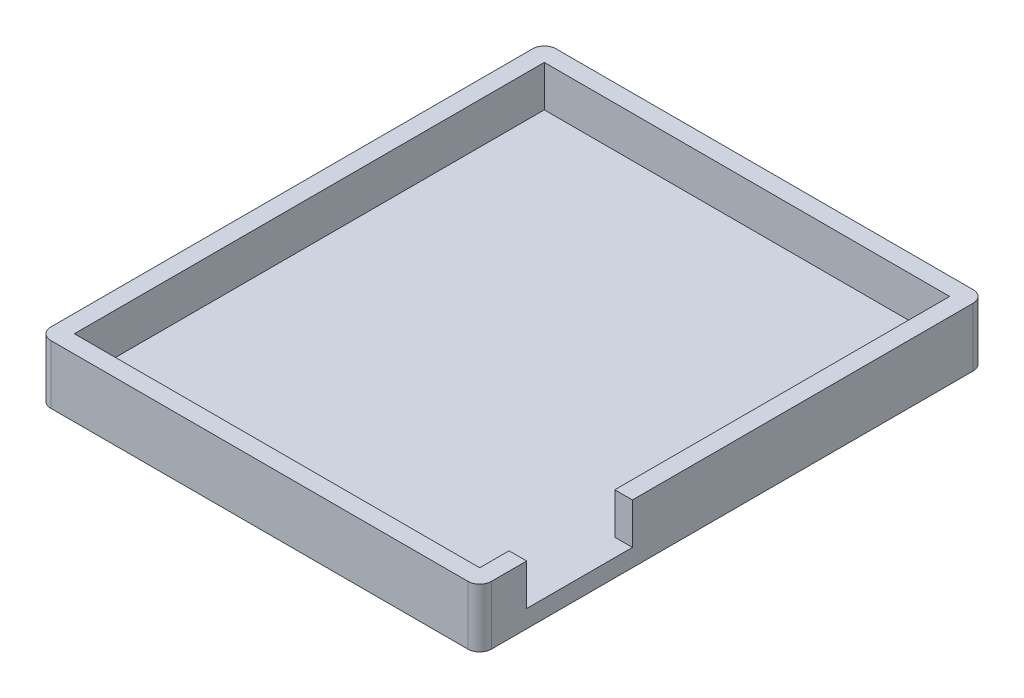
ISO-10303-21;
HEADER;
FILE_DESCRIPTION(('STEP AP214'),'2;1');
FILE_NAME('part.step','',(''),(''),'','','');
FILE_SCHEMA(('AUTOMOTIVE_DESIGN { 1 0 10303 214 1 1 1 1 }'));
ENDSEC;
DATA;
#1=APPLICATION_CONTEXT('core data for automotive mechanical design processes');
#2=APPLICATION_PROTOCOL_DEFINITION('international standard','automotive_design',2000,#1);
#3=PRODUCT_CONTEXT('',#1,'mechanical');
#4=PRODUCT('Part','Part','',(#3));
#5=PRODUCT_RELATED_PRODUCT_CATEGORY('part','',(#4));
#6=PRODUCT_DEFINITION_FORMATION('','',#4);
#7=PRODUCT_DEFINITION_CONTEXT('part definition',#1,'design');
#8=PRODUCT_DEFINITION('design','',#6,#7);
#9=PRODUCT_DEFINITION_SHAPE('','',#8);
#10=(LENGTH_UNIT() NAMED_UNIT(*) SI_UNIT(.MILLI.,.METRE.));
#11=(NAMED_UNIT(*) PLANE_ANGLE_UNIT() SI_UNIT($,.RADIAN.));
#12=(NAMED_UNIT(*) SI_UNIT($,.STERADIAN.) SOLID_ANGLE_UNIT());
#13=UNCERTAINTY_MEASURE_WITH_UNIT(LENGTH_MEASURE(1.E-05),#10,'distance_accuracy_value','');
#14=(GEOMETRIC_REPRESENTATION_CONTEXT(3) GLOBAL_UNCERTAINTY_ASSIGNED_CONTEXT((#13)) GLOBAL_UNIT_ASSIGNED_CONTEXT((#10,
#11,#12)) REPRESENTATION_CONTEXT('',''));
#15=CARTESIAN_POINT('',(0.,0.,0.));
#16=DIRECTION('',(0.,0.,1.));
#17=DIRECTION('',(1.,0.,0.));
#18=AXIS2_PLACEMENT_3D('',#15,#16,#17);
#19=CARTESIAN_POINT('',(37.5,3.,0.));
#20=DIRECTION('',(-1.,0.,0.));
#21=DIRECTION('',(0.,0.,1.));
#22=AXIS2_PLACEMENT_3D('',#19,#20,#21);
#23=PLANE('',#22);
#24=DIRECTION('',(0.,0.,-1.));
#25=VECTOR('',#24,1.);
#26=CARTESIAN_POINT('',(37.5,0.,0.));
#27=LINE('',#26,#25);
#28=CARTESIAN_POINT('',(37.5,0.,41.));
#29=VERTEX_POINT('',#28);
#30=CARTESIAN_POINT('',(37.5,0.,-41.));
#31=VERTEX_POINT('',#30);
#32=EDGE_CURVE('E235',#29,#31,#27,.T.);
#33=ORIENTED_EDGE('',*,*,#32,.T.);
#34=DIRECTION('',(0.,-1.,0.));
#35=VECTOR('',#34,1.);
#36=CARTESIAN_POINT('',(37.5,3.,-41.));
#37=LINE('',#36,#35);
#38=CARTESIAN_POINT('',(37.5,10.,-41.));
#39=VERTEX_POINT('',#38);
#40=EDGE_CURVE('E268',#31,#39,#37,.F.);
#41=ORIENTED_EDGE('',*,*,#40,.T.);
#42=DIRECTION('',(0.,0.,-1.));
#43=VECTOR('',#42,1.);
#44=CARTESIAN_POINT('',(37.5,10.,43.));
#45=LINE('',#44,#43);
#46=CARTESIAN_POINT('',(37.5,10.,17.));
#47=VERTEX_POINT('',#46);
#48=EDGE_CURVE('E211',#47,#39,#45,.T.);
#49=ORIENTED_EDGE('',*,*,#48,.F.);
#50=DIRECTION('',(0.,1.,0.));
#51=VECTOR('',#50,1.);
#52=CARTESIAN_POINT('',(37.5,0.,17.));
#53=LINE('',#52,#51);
#54=CARTESIAN_POINT('',(37.5,3.,17.));
#55=VERTEX_POINT('',#54);
#56=EDGE_CURVE('E159',#55,#47,#53,.T.);
#57=ORIENTED_EDGE('',*,*,#56,.F.);
#58=DIRECTION('',(0.,0.,1.));
#59=VECTOR('',#58,1.);
#60=CARTESIAN_POINT('',(37.5,3.,0.));
#61=LINE('',#60,#59);
#62=CARTESIAN_POINT('',(37.5,3.,35.));
#63=VERTEX_POINT('',#62);
#64=EDGE_CURVE('E152',#55,#63,#61,.T.);
#65=ORIENTED_EDGE('',*,*,#64,.T.);
#66=DIRECTION('',(0.,1.,0.));
#67=VECTOR('',#66,1.);
#68=CARTESIAN_POINT('',(37.5,0.,35.));
#69=LINE('',#68,#67);
#70=CARTESIAN_POINT('',(37.5,10.,35.));
#71=VERTEX_POINT('',#70);
#72=EDGE_CURVE('E163',#63,#71,#69,.T.);
#73=ORIENTED_EDGE('',*,*,#72,.T.);
#74=CARTESIAN_POINT('',(37.5,10.,41.));
#75=VERTEX_POINT('',#74);
#76=EDGE_CURVE('E212',#75,#71,#45,.T.);
#77=ORIENTED_EDGE('',*,*,#76,.F.);
#78=DIRECTION('',(0.,-1.,0.));
#79=VECTOR('',#78,1.);
#80=CARTESIAN_POINT('',(37.5,0.,41.));
#81=LINE('',#80,#79);
#82=EDGE_CURVE('E265',#75,#29,#81,.T.);
#83=ORIENTED_EDGE('',*,*,#82,.T.);
#84=EDGE_LOOP('',(#33,#41,#49,#57,#65,#73,#77,#83));
#85=FACE_BOUND('',#84,.T.);
#86=ADVANCED_FACE('F35',(#85),#23,.F.);
#87=CARTESIAN_POINT('',(0.,10.,0.));
#88=DIRECTION('',(0.,1.,0.));
#89=DIRECTION('',(0.,0.,1.));
#90=AXIS2_PLACEMENT_3D('',#87,#88,#89);
#91=PLANE('',#90);
#92=DIRECTION('',(-1.,0.,0.));
#93=VECTOR('',#92,1.);
#94=CARTESIAN_POINT('',(37.5,10.,-43.));
#95=LINE('',#94,#93);
#96=CARTESIAN_POINT('',(35.5,10.,-43.));
#97=VERTEX_POINT('',#96);
#98=CARTESIAN_POINT('',(-35.5,10.,-43.));
#99=VERTEX_POINT('',#98);
#100=EDGE_CURVE('E214',#97,#99,#95,.T.);
#101=ORIENTED_EDGE('',*,*,#100,.T.);
#102=CARTESIAN_POINT('',(-35.5,10.,-41.));
#103=DIRECTION('',(0.,1.,0.));
#104=DIRECTION('',(0.,0.,1.));
#105=AXIS2_PLACEMENT_3D('',#102,#103,#104);
#106=CIRCLE('',#105,2.);
#107=CARTESIAN_POINT('',(-37.5,10.,-41.));
#108=VERTEX_POINT('',#107);
#109=EDGE_CURVE('E263',#99,#108,#106,.T.);
#110=ORIENTED_EDGE('',*,*,#109,.T.);
#111=DIRECTION('',(0.,0.,1.));
#112=VECTOR('',#111,1.);
#113=CARTESIAN_POINT('',(-37.5,10.,43.));
#114=LINE('',#113,#112);
#115=CARTESIAN_POINT('',(-37.5,10.,41.));
#116=VERTEX_POINT('',#115);
#117=EDGE_CURVE('E207',#108,#116,#114,.T.);
#118=ORIENTED_EDGE('',*,*,#117,.T.);
#119=CARTESIAN_POINT('',(-35.5,10.,41.));
#120=DIRECTION('',(0.,1.,0.));
#121=DIRECTION('',(0.,0.,1.));
#122=AXIS2_PLACEMENT_3D('',#119,#120,#121);
#123=CIRCLE('',#122,2.);
#124=CARTESIAN_POINT('',(-35.5,10.,43.));
#125=VERTEX_POINT('',#124);
#126=EDGE_CURVE('E55',#116,#125,#123,.T.);
#127=ORIENTED_EDGE('',*,*,#126,.T.);
#128=DIRECTION('',(1.,0.,0.));
#129=VECTOR('',#128,1.);
#130=CARTESIAN_POINT('',(37.5,10.,43.));
#131=LINE('',#130,#129);
#132=CARTESIAN_POINT('',(35.5,10.,43.));
#133=VERTEX_POINT('',#132);
#134=EDGE_CURVE('E209',#125,#133,#131,.T.);
#135=ORIENTED_EDGE('',*,*,#134,.T.);
#136=CARTESIAN_POINT('',(35.5,10.,41.));
#137=DIRECTION('',(0.,1.,0.));
#138=DIRECTION('',(0.,0.,1.));
#139=AXIS2_PLACEMENT_3D('',#136,#137,#138);
#140=CIRCLE('',#139,2.);
#141=EDGE_CURVE('E259',#133,#75,#140,.T.);
#142=ORIENTED_EDGE('',*,*,#141,.T.);
#143=ORIENTED_EDGE('',*,*,#76,.T.);
#144=DIRECTION('',(1.,0.,0.));
#145=VECTOR('',#144,1.);
#146=CARTESIAN_POINT('',(27.5,10.,35.));
#147=LINE('',#146,#145);
#148=CARTESIAN_POINT('',(34.5,10.,35.));
#149=VERTEX_POINT('',#148);
#150=EDGE_CURVE('E166',#149,#71,#147,.T.);
#151=ORIENTED_EDGE('',*,*,#150,.F.);
#152=DIRECTION('',(0.,0.,-1.));
#153=VECTOR('',#152,1.);
#154=CARTESIAN_POINT('',(34.5,10.,40.));
#155=LINE('',#154,#153);
#156=CARTESIAN_POINT('',(34.5,10.,40.));
#157=VERTEX_POINT('',#156);
#158=EDGE_CURVE('E190',#157,#149,#155,.T.);
#159=ORIENTED_EDGE('',*,*,#158,.F.);
#160=DIRECTION('',(1.,0.,0.));
#161=VECTOR('',#160,1.);
#162=CARTESIAN_POINT('',(34.5,10.,40.));
#163=LINE('',#162,#161);
#164=CARTESIAN_POINT('',(-34.5,10.,40.));
#165=VERTEX_POINT('',#164);
#166=EDGE_CURVE('E187',#165,#157,#163,.T.);
#167=ORIENTED_EDGE('',*,*,#166,.F.);
#168=DIRECTION('',(0.,0.,1.));
#169=VECTOR('',#168,1.);
#170=CARTESIAN_POINT('',(-34.5,10.,40.));
#171=LINE('',#170,#169);
#172=CARTESIAN_POINT('',(-34.5,10.,-40.));
#173=VERTEX_POINT('',#172);
#174=EDGE_CURVE('E185',#173,#165,#171,.T.);
#175=ORIENTED_EDGE('',*,*,#174,.F.);
#176=DIRECTION('',(-1.,0.,0.));
#177=VECTOR('',#176,1.);
#178=CARTESIAN_POINT('',(34.5,10.,-40.));
#179=LINE('',#178,#177);
#180=CARTESIAN_POINT('',(34.5,10.,-40.));
#181=VERTEX_POINT('',#180);
#182=EDGE_CURVE('E193',#181,#173,#179,.T.);
#183=ORIENTED_EDGE('',*,*,#182,.F.);
#184=CARTESIAN_POINT('',(34.5,10.,17.));
#185=VERTEX_POINT('',#184);
#186=EDGE_CURVE('E189',#185,#181,#155,.T.);
#187=ORIENTED_EDGE('',*,*,#186,.F.);
#188=DIRECTION('',(1.,0.,0.));
#189=VECTOR('',#188,1.);
#190=CARTESIAN_POINT('',(27.5,10.,17.));
#191=LINE('',#190,#189);
#192=EDGE_CURVE('E177',#185,#47,#191,.T.);
#193=ORIENTED_EDGE('',*,*,#192,.T.);
#194=ORIENTED_EDGE('',*,*,#48,.T.);
#195=CARTESIAN_POINT('',(35.5,10.,-41.));
#196=DIRECTION('',(0.,1.,0.));
#197=DIRECTION('',(0.,0.,1.));
#198=AXIS2_PLACEMENT_3D('',#195,#196,#197);
#199=CIRCLE('',#198,2.);
#200=EDGE_CURVE('E261',#39,#97,#199,.T.);
#201=ORIENTED_EDGE('',*,*,#200,.T.);
#202=EDGE_LOOP('',(#101,#110,#118,#127,#135,#142,#143,#151,#159,#167,#175,#183,#187,#193,#194,#201));
#203=FACE_BOUND('',#202,.T.);
#204=ADVANCED_FACE('F282',(#203),#91,.T.);
#205=CARTESIAN_POINT('',(34.5,10.,40.));
#206=DIRECTION('',(-1.,0.,0.));
#207=DIRECTION('',(0.,0.,1.));
#208=AXIS2_PLACEMENT_3D('',#205,#206,#207);
#209=PLANE('',#208);
#210=ORIENTED_EDGE('',*,*,#158,.T.);
#211=DIRECTION('',(0.,-1.,0.));
#212=VECTOR('',#211,1.);
#213=CARTESIAN_POINT('',(34.5,10.,35.));
#214=LINE('',#213,#212);
#215=CARTESIAN_POINT('',(34.5,3.,35.));
#216=VERTEX_POINT('',#215);
#217=EDGE_CURVE('E183',#149,#216,#214,.T.);
#218=ORIENTED_EDGE('',*,*,#217,.T.);
#219=DIRECTION('',(0.,0.,1.));
#220=VECTOR('',#219,1.);
#221=CARTESIAN_POINT('',(34.5,3.,0.));
#222=LINE('',#221,#220);
#223=CARTESIAN_POINT('',(34.5,3.,40.));
#224=VERTEX_POINT('',#223);
#225=EDGE_CURVE('E155',#216,#224,#222,.T.);
#226=ORIENTED_EDGE('',*,*,#225,.T.);
#227=DIRECTION('',(0.,-1.,0.));
#228=VECTOR('',#227,1.);
#229=CARTESIAN_POINT('',(34.5,10.,40.));
#230=LINE('',#229,#228);
#231=EDGE_CURVE('E201',#157,#224,#230,.T.);
#232=ORIENTED_EDGE('',*,*,#231,.F.);
#233=EDGE_LOOP('',(#210,#218,#226,#232));
#234=FACE_BOUND('',#233,.T.);
#235=ADVANCED_FACE('F287',(#234),#209,.T.);
#236=CARTESIAN_POINT('',(-37.5,3.,0.));
#237=DIRECTION('',(-1.,0.,0.));
#238=DIRECTION('',(0.,0.,1.));
#239=AXIS2_PLACEMENT_3D('',#236,#237,#238);
#240=PLANE('',#239);
#241=ORIENTED_EDGE('',*,*,#117,.F.);
#242=DIRECTION('',(0.,-1.,0.));
#243=VECTOR('',#242,1.);
#244=CARTESIAN_POINT('',(-37.5,0.,-41.));
#245=LINE('',#244,#243);
#246=CARTESIAN_POINT('',(-37.5,0.,-41.));
#247=VERTEX_POINT('',#246);
#248=EDGE_CURVE('E242',#108,#247,#245,.T.);
#249=ORIENTED_EDGE('',*,*,#248,.T.);
#250=DIRECTION('',(0.,0.,-1.));
#251=VECTOR('',#250,1.);
#252=CARTESIAN_POINT('',(-37.5,0.,0.));
#253=LINE('',#252,#251);
#254=CARTESIAN_POINT('',(-37.5,0.,41.));
#255=VERTEX_POINT('',#254);
#256=EDGE_CURVE('E229',#255,#247,#253,.T.);
#257=ORIENTED_EDGE('',*,*,#256,.F.);
#258=DIRECTION('',(0.,-1.,0.));
#259=VECTOR('',#258,1.);
#260=CARTESIAN_POINT('',(-37.5,3.,41.));
#261=LINE('',#260,#259);
#262=EDGE_CURVE('E240',#255,#116,#261,.F.);
#263=ORIENTED_EDGE('',*,*,#262,.T.);
#264=EDGE_LOOP('',(#241,#249,#257,#263));
#265=FACE_BOUND('',#264,.T.);
#266=ADVANCED_FACE('F320',(#265),#240,.T.);
#267=CARTESIAN_POINT('',(0.,3.,43.));
#268=DIRECTION('',(0.,0.,1.));
#269=DIRECTION('',(1.,0.,0.));
#270=AXIS2_PLACEMENT_3D('',#267,#268,#269);
#271=PLANE('',#270);
#272=DIRECTION('',(-1.,0.,0.));
#273=VECTOR('',#272,1.);
#274=CARTESIAN_POINT('',(0.,0.,43.));
#275=LINE('',#274,#273);
#276=CARTESIAN_POINT('',(35.5,0.,43.));
#277=VERTEX_POINT('',#276);
#278=CARTESIAN_POINT('',(-35.5,0.,43.));
#279=VERTEX_POINT('',#278);
#280=EDGE_CURVE('E232',#277,#279,#275,.T.);
#281=ORIENTED_EDGE('',*,*,#280,.F.);
#282=DIRECTION('',(0.,-1.,0.));
#283=VECTOR('',#282,1.);
#284=CARTESIAN_POINT('',(35.5,10.,43.));
#285=LINE('',#284,#283);
#286=EDGE_CURVE('E11',#277,#133,#285,.F.);
#287=ORIENTED_EDGE('',*,*,#286,.T.);
#288=ORIENTED_EDGE('',*,*,#134,.F.);
#289=DIRECTION('',(0.,-1.,0.));
#290=VECTOR('',#289,1.);
#291=CARTESIAN_POINT('',(-35.5,3.,43.));
#292=LINE('',#291,#290);
#293=EDGE_CURVE('E43',#125,#279,#292,.T.);
#294=ORIENTED_EDGE('',*,*,#293,.T.);
#295=EDGE_LOOP('',(#281,#287,#288,#294));
#296=FACE_BOUND('',#295,.T.);
#297=ADVANCED_FACE('F271',(#296),#271,.T.);
#298=CARTESIAN_POINT('',(0.,3.,-43.));
#299=DIRECTION('',(0.,0.,1.));
#300=DIRECTION('',(1.,0.,0.));
#301=AXIS2_PLACEMENT_3D('',#298,#299,#300);
#302=PLANE('',#301);
#303=DIRECTION('',(-1.,0.,0.));
#304=VECTOR('',#303,1.);
#305=CARTESIAN_POINT('',(0.,0.,-43.));
#306=LINE('',#305,#304);
#307=CARTESIAN_POINT('',(35.5,0.,-43.));
#308=VERTEX_POINT('',#307);
#309=CARTESIAN_POINT('',(-35.5,0.,-43.));
#310=VERTEX_POINT('',#309);
#311=EDGE_CURVE('E237',#308,#310,#306,.T.);
#312=ORIENTED_EDGE('',*,*,#311,.T.);
#313=DIRECTION('',(0.,-1.,0.));
#314=VECTOR('',#313,1.);
#315=CARTESIAN_POINT('',(-35.5,10.,-43.));
#316=LINE('',#315,#314);
#317=EDGE_CURVE('E256',#310,#99,#316,.F.);
#318=ORIENTED_EDGE('',*,*,#317,.T.);
#319=ORIENTED_EDGE('',*,*,#100,.F.);
#320=DIRECTION('',(0.,-1.,0.));
#321=VECTOR('',#320,1.);
#322=CARTESIAN_POINT('',(35.5,3.,-43.));
#323=LINE('',#322,#321);
#324=EDGE_CURVE('E253',#97,#308,#323,.T.);
#325=ORIENTED_EDGE('',*,*,#324,.T.);
#326=EDGE_LOOP('',(#312,#318,#319,#325));
#327=FACE_BOUND('',#326,.T.);
#328=ADVANCED_FACE('F312',(#327),#302,.F.);
#329=CARTESIAN_POINT('',(0.,0.,0.));
#330=DIRECTION('',(0.,1.,0.));
#331=DIRECTION('',(0.,0.,1.));
#332=AXIS2_PLACEMENT_3D('',#329,#330,#331);
#333=PLANE('',#332);
#334=ORIENTED_EDGE('',*,*,#256,.T.);
#335=CARTESIAN_POINT('',(-35.5,0.,-41.));
#336=DIRECTION('',(0.,1.,0.));
#337=DIRECTION('',(0.,0.,1.));
#338=AXIS2_PLACEMENT_3D('',#335,#336,#337);
#339=CIRCLE('',#338,2.);
#340=EDGE_CURVE('E251',#247,#310,#339,.F.);
#341=ORIENTED_EDGE('',*,*,#340,.T.);
#342=ORIENTED_EDGE('',*,*,#311,.F.);
#343=CARTESIAN_POINT('',(35.5,0.,-41.));
#344=DIRECTION('',(0.,1.,0.));
#345=DIRECTION('',(0.,0.,1.));
#346=AXIS2_PLACEMENT_3D('',#343,#344,#345);
#347=CIRCLE('',#346,2.);
#348=EDGE_CURVE('E249',#308,#31,#347,.F.);
#349=ORIENTED_EDGE('',*,*,#348,.T.);
#350=ORIENTED_EDGE('',*,*,#32,.F.);
#351=CARTESIAN_POINT('',(35.5,0.,41.));
#352=DIRECTION('',(0.,1.,0.));
#353=DIRECTION('',(0.,0.,1.));
#354=AXIS2_PLACEMENT_3D('',#351,#352,#353);
#355=CIRCLE('',#354,2.);
#356=EDGE_CURVE('E247',#29,#277,#355,.F.);
#357=ORIENTED_EDGE('',*,*,#356,.T.);
#358=ORIENTED_EDGE('',*,*,#280,.T.);
#359=CARTESIAN_POINT('',(-35.5,0.,41.));
#360=DIRECTION('',(0.,1.,0.));
#361=DIRECTION('',(0.,0.,1.));
#362=AXIS2_PLACEMENT_3D('',#359,#360,#361);
#363=CIRCLE('',#362,2.);
#364=EDGE_CURVE('E245',#279,#255,#363,.F.);
#365=ORIENTED_EDGE('',*,*,#364,.T.);
#366=EDGE_LOOP('',(#334,#341,#342,#349,#350,#357,#358,#365));
#367=FACE_BOUND('',#366,.T.);
#368=ADVANCED_FACE('F274',(#367),#333,.F.);
#369=CARTESIAN_POINT('',(-34.5,10.,40.));
#370=DIRECTION('',(1.,0.,0.));
#371=DIRECTION('',(0.,0.,-1.));
#372=AXIS2_PLACEMENT_3D('',#369,#370,#371);
#373=PLANE('',#372);
#374=DIRECTION('',(0.,-1.,0.));
#375=VECTOR('',#374,1.);
#376=CARTESIAN_POINT('',(-34.5,10.,40.));
#377=LINE('',#376,#375);
#378=CARTESIAN_POINT('',(-34.5,3.,40.));
#379=VERTEX_POINT('',#378);
#380=EDGE_CURVE('E204',#165,#379,#377,.T.);
#381=ORIENTED_EDGE('',*,*,#380,.T.);
#382=DIRECTION('',(0.,0.,-1.));
#383=VECTOR('',#382,1.);
#384=CARTESIAN_POINT('',(-34.5,3.,0.));
#385=LINE('',#384,#383);
#386=CARTESIAN_POINT('',(-34.5,3.,-40.));
#387=VERTEX_POINT('',#386);
#388=EDGE_CURVE('E226',#379,#387,#385,.T.);
#389=ORIENTED_EDGE('',*,*,#388,.T.);
#390=DIRECTION('',(0.,-1.,0.));
#391=VECTOR('',#390,1.);
#392=CARTESIAN_POINT('',(-34.5,10.,-40.));
#393=LINE('',#392,#391);
#394=EDGE_CURVE('E195',#173,#387,#393,.T.);
#395=ORIENTED_EDGE('',*,*,#394,.F.);
#396=ORIENTED_EDGE('',*,*,#174,.T.);
#397=EDGE_LOOP('',(#381,#389,#395,#396));
#398=FACE_BOUND('',#397,.T.);
#399=ADVANCED_FACE('F296',(#398),#373,.T.);
#400=CARTESIAN_POINT('',(34.5,10.,40.));
#401=DIRECTION('',(0.,0.,-1.));
#402=DIRECTION('',(-1.,0.,0.));
#403=AXIS2_PLACEMENT_3D('',#400,#401,#402);
#404=PLANE('',#403);
#405=ORIENTED_EDGE('',*,*,#231,.T.);
#406=DIRECTION('',(-1.,0.,0.));
#407=VECTOR('',#406,1.);
#408=CARTESIAN_POINT('',(0.,3.,40.));
#409=LINE('',#408,#407);
#410=EDGE_CURVE('E223',#224,#379,#409,.T.);
#411=ORIENTED_EDGE('',*,*,#410,.T.);
#412=ORIENTED_EDGE('',*,*,#380,.F.);
#413=ORIENTED_EDGE('',*,*,#166,.T.);
#414=EDGE_LOOP('',(#405,#411,#412,#413));
#415=FACE_BOUND('',#414,.T.);
#416=ADVANCED_FACE('F289',(#415),#404,.T.);
#417=DIRECTION('',(0.,-1.,0.));
#418=VECTOR('',#417,1.);
#419=CARTESIAN_POINT('',(34.5,10.,17.));
#420=LINE('',#419,#418);
#421=CARTESIAN_POINT('',(34.5,3.,17.));
#422=VERTEX_POINT('',#421);
#423=EDGE_CURVE('E176',#185,#422,#420,.T.);
#424=ORIENTED_EDGE('',*,*,#423,.F.);
#425=ORIENTED_EDGE('',*,*,#186,.T.);
#426=DIRECTION('',(0.,-1.,0.));
#427=VECTOR('',#426,1.);
#428=CARTESIAN_POINT('',(34.5,10.,-40.));
#429=LINE('',#428,#427);
#430=CARTESIAN_POINT('',(34.5,3.,-40.));
#431=VERTEX_POINT('',#430);
#432=EDGE_CURVE('E198',#181,#431,#429,.T.);
#433=ORIENTED_EDGE('',*,*,#432,.T.);
#434=EDGE_CURVE('E220',#431,#422,#222,.T.);
#435=ORIENTED_EDGE('',*,*,#434,.T.);
#436=EDGE_LOOP('',(#424,#425,#433,#435));
#437=FACE_BOUND('',#436,.T.);
#438=ADVANCED_FACE('F302',(#437),#209,.T.);
#439=CARTESIAN_POINT('',(34.5,10.,-40.));
#440=DIRECTION('',(0.,0.,1.));
#441=DIRECTION('',(1.,0.,0.));
#442=AXIS2_PLACEMENT_3D('',#439,#440,#441);
#443=PLANE('',#442);
#444=ORIENTED_EDGE('',*,*,#394,.T.);
#445=DIRECTION('',(1.,0.,0.));
#446=VECTOR('',#445,1.);
#447=CARTESIAN_POINT('',(0.,3.,-40.));
#448=LINE('',#447,#446);
#449=EDGE_CURVE('E217',#387,#431,#448,.T.);
#450=ORIENTED_EDGE('',*,*,#449,.T.);
#451=ORIENTED_EDGE('',*,*,#432,.F.);
#452=ORIENTED_EDGE('',*,*,#182,.T.);
#453=EDGE_LOOP('',(#444,#450,#451,#452));
#454=FACE_BOUND('',#453,.T.);
#455=ADVANCED_FACE('F298',(#454),#443,.T.);
#456=CARTESIAN_POINT('',(0.,3.,0.));
#457=DIRECTION('',(0.,1.,0.));
#458=DIRECTION('',(0.,0.,1.));
#459=AXIS2_PLACEMENT_3D('',#456,#457,#458);
#460=PLANE('',#459);
#461=ORIENTED_EDGE('',*,*,#225,.F.);
#462=DIRECTION('',(1.,0.,0.));
#463=VECTOR('',#462,1.);
#464=CARTESIAN_POINT('',(27.5,3.,35.));
#465=LINE('',#464,#463);
#466=EDGE_CURVE('E148',#216,#63,#465,.T.);
#467=ORIENTED_EDGE('',*,*,#466,.T.);
#468=ORIENTED_EDGE('',*,*,#64,.F.);
#469=DIRECTION('',(1.,0.,0.));
#470=VECTOR('',#469,1.);
#471=CARTESIAN_POINT('',(27.5,3.,17.));
#472=LINE('',#471,#470);
#473=EDGE_CURVE('E158',#422,#55,#472,.T.);
#474=ORIENTED_EDGE('',*,*,#473,.F.);
#475=ORIENTED_EDGE('',*,*,#434,.F.);
#476=ORIENTED_EDGE('',*,*,#449,.F.);
#477=ORIENTED_EDGE('',*,*,#388,.F.);
#478=ORIENTED_EDGE('',*,*,#410,.F.);
#479=EDGE_LOOP('',(#461,#467,#468,#474,#475,#476,#477,#478));
#480=FACE_BOUND('',#479,.T.);
#481=ADVANCED_FACE('F150',(#480),#460,.T.);
#482=CARTESIAN_POINT('',(27.5,0.,35.));
#483=DIRECTION('',(0.,0.,-1.));
#484=DIRECTION('',(-1.,0.,0.));
#485=AXIS2_PLACEMENT_3D('',#482,#483,#484);
#486=PLANE('',#485);
#487=ORIENTED_EDGE('',*,*,#150,.T.);
#488=ORIENTED_EDGE('',*,*,#72,.F.);
#489=ORIENTED_EDGE('',*,*,#466,.F.);
#490=ORIENTED_EDGE('',*,*,#217,.F.);
#491=EDGE_LOOP('',(#487,#488,#489,#490));
#492=FACE_BOUND('',#491,.T.);
#493=ADVANCED_FACE('F164',(#492),#486,.T.);
#494=CARTESIAN_POINT('',(27.5,0.,17.));
#495=DIRECTION('',(0.,0.,-1.));
#496=DIRECTION('',(-1.,0.,0.));
#497=AXIS2_PLACEMENT_3D('',#494,#495,#496);
#498=PLANE('',#497);
#499=ORIENTED_EDGE('',*,*,#423,.T.);
#500=ORIENTED_EDGE('',*,*,#473,.T.);
#501=ORIENTED_EDGE('',*,*,#56,.T.);
#502=ORIENTED_EDGE('',*,*,#192,.F.);
#503=EDGE_LOOP('',(#499,#500,#501,#502));
#504=FACE_BOUND('',#503,.T.);
#505=ADVANCED_FACE('F341',(#504),#498,.F.);
#506=CARTESIAN_POINT('',(-35.5,3.,-41.));
#507=DIRECTION('',(0.,1.,0.));
#508=DIRECTION('',(0.,0.,1.));
#509=AXIS2_PLACEMENT_3D('',#506,#507,#508);
#510=CYLINDRICAL_SURFACE('',#509,2.);
#511=ORIENTED_EDGE('',*,*,#109,.F.);
#512=ORIENTED_EDGE('',*,*,#317,.F.);
#513=ORIENTED_EDGE('',*,*,#340,.F.);
#514=ORIENTED_EDGE('',*,*,#248,.F.);
#515=EDGE_LOOP('',(#511,#512,#513,#514));
#516=FACE_BOUND('',#515,.T.);
#517=ADVANCED_FACE('F316',(#516),#510,.T.);
#518=CARTESIAN_POINT('',(35.5,3.,-41.));
#519=DIRECTION('',(0.,-1.,0.));
#520=DIRECTION('',(0.,0.,-1.));
#521=AXIS2_PLACEMENT_3D('',#518,#519,#520);
#522=CYLINDRICAL_SURFACE('',#521,2.);
#523=ORIENTED_EDGE('',*,*,#200,.F.);
#524=ORIENTED_EDGE('',*,*,#40,.F.);
#525=ORIENTED_EDGE('',*,*,#348,.F.);
#526=ORIENTED_EDGE('',*,*,#324,.F.);
#527=EDGE_LOOP('',(#523,#524,#525,#526));
#528=FACE_BOUND('',#527,.T.);
#529=ADVANCED_FACE('F307',(#528),#522,.T.);
#530=CARTESIAN_POINT('',(35.5,3.,41.));
#531=DIRECTION('',(0.,1.,0.));
#532=DIRECTION('',(0.,0.,1.));
#533=AXIS2_PLACEMENT_3D('',#530,#531,#532);
#534=CYLINDRICAL_SURFACE('',#533,2.);
#535=ORIENTED_EDGE('',*,*,#141,.F.);
#536=ORIENTED_EDGE('',*,*,#286,.F.);
#537=ORIENTED_EDGE('',*,*,#356,.F.);
#538=ORIENTED_EDGE('',*,*,#82,.F.);
#539=EDGE_LOOP('',(#535,#536,#537,#538));
#540=FACE_BOUND('',#539,.T.);
#541=ADVANCED_FACE('F280',(#540),#534,.T.);
#542=CARTESIAN_POINT('',(-35.5,3.,41.));
#543=DIRECTION('',(0.,-1.,0.));
#544=DIRECTION('',(0.,0.,-1.));
#545=AXIS2_PLACEMENT_3D('',#542,#543,#544);
#546=CYLINDRICAL_SURFACE('',#545,2.);
#547=ORIENTED_EDGE('',*,*,#126,.F.);
#548=ORIENTED_EDGE('',*,*,#262,.F.);
#549=ORIENTED_EDGE('',*,*,#364,.F.);
#550=ORIENTED_EDGE('',*,*,#293,.F.);
#551=EDGE_LOOP('',(#547,#548,#549,#550));
#552=FACE_BOUND('',#551,.T.);
#553=ADVANCED_FACE('F37',(#552),#546,.T.);
#554=CLOSED_SHELL('',(#86,#204,#235,#266,#297,#328,#368,#399,#416,#438,#455,#481,#493,#505,#517,
#529,#541,#553));
#555=MANIFOLD_SOLID_BREP('B2',#554);
#556=ADVANCED_BREP_SHAPE_REPRESENTATION('',(#18,#555),#14);
#557=SHAPE_DEFINITION_REPRESENTATION(#9,#556);
ENDSEC;
END-ISO-10303-21;
